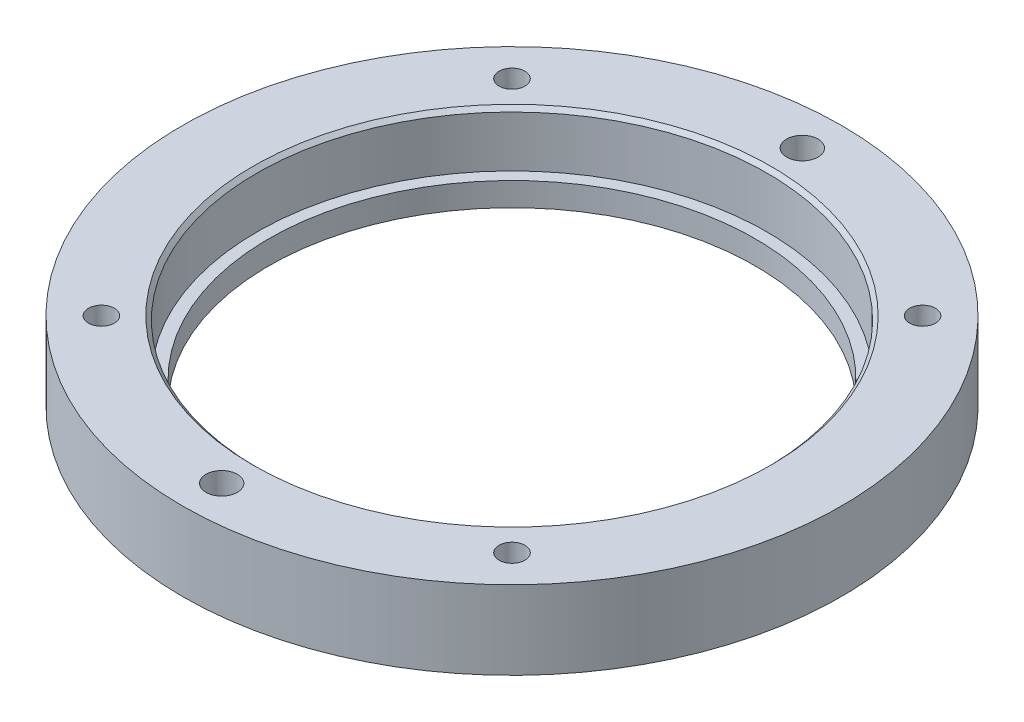
ISO-10303-21;
HEADER;
FILE_DESCRIPTION(('STEP AP214'),'2;1');
FILE_NAME('part.step','',(''),(''),'','','');
FILE_SCHEMA(('AUTOMOTIVE_DESIGN { 1 0 10303 214 1 1 1 1 }'));
ENDSEC;
DATA;
#1=APPLICATION_CONTEXT('core data for automotive mechanical design processes');
#2=APPLICATION_PROTOCOL_DEFINITION('international standard','automotive_design',2000,#1);
#3=PRODUCT_CONTEXT('',#1,'mechanical');
#4=PRODUCT('Part','Part','',(#3));
#5=PRODUCT_RELATED_PRODUCT_CATEGORY('part','',(#4));
#6=PRODUCT_DEFINITION_FORMATION('','',#4);
#7=PRODUCT_DEFINITION_CONTEXT('part definition',#1,'design');
#8=PRODUCT_DEFINITION('design','',#6,#7);
#9=PRODUCT_DEFINITION_SHAPE('','',#8);
#10=(LENGTH_UNIT() NAMED_UNIT(*) SI_UNIT(.MILLI.,.METRE.));
#11=(NAMED_UNIT(*) PLANE_ANGLE_UNIT() SI_UNIT($,.RADIAN.));
#12=(NAMED_UNIT(*) SI_UNIT($,.STERADIAN.) SOLID_ANGLE_UNIT());
#13=UNCERTAINTY_MEASURE_WITH_UNIT(LENGTH_MEASURE(1.E-05),#10,'distance_accuracy_value','');
#14=(GEOMETRIC_REPRESENTATION_CONTEXT(3) GLOBAL_UNCERTAINTY_ASSIGNED_CONTEXT((#13)) GLOBAL_UNIT_ASSIGNED_CONTEXT((#10,
#11,#12)) REPRESENTATION_CONTEXT('',''));
#15=CARTESIAN_POINT('',(0.,0.,0.));
#16=DIRECTION('',(0.,0.,1.));
#17=DIRECTION('',(1.,0.,0.));
#18=AXIS2_PLACEMENT_3D('',#15,#16,#17);
#19=CARTESIAN_POINT('',(0.,-3.,42.));
#20=DIRECTION('',(0.,-1.,0.));
#21=DIRECTION('',(0.,0.,-1.));
#22=AXIS2_PLACEMENT_3D('',#19,#20,#21);
#23=PLANE('',#22);
#24=CARTESIAN_POINT('',(-26.1629509039025,-3.,26.162950903902));
#25=DIRECTION('',(0.,-1.,0.));
#26=DIRECTION('',(0.,0.,-1.));
#27=AXIS2_PLACEMENT_3D('',#24,#25,#26);
#28=CIRCLE('',#27,1.64999999999999);
#29=CARTESIAN_POINT('',(-26.1629509039025,-3.,24.512950903902));
#30=VERTEX_POINT('',#29);
#31=EDGE_CURVE('E159',#30,#30,#28,.T.);
#32=ORIENTED_EDGE('',*,*,#31,.F.);
#33=EDGE_LOOP('',(#32));
#34=FACE_BOUND('',#33,.T.);
#35=CARTESIAN_POINT('',(26.1629509039023,-3.,26.1629509039022));
#36=DIRECTION('',(0.,-1.,0.));
#37=DIRECTION('',(0.,0.,-1.));
#38=AXIS2_PLACEMENT_3D('',#35,#36,#37);
#39=CIRCLE('',#38,1.64999999999999);
#40=CARTESIAN_POINT('',(26.1629509039023,-3.,24.5129509039022));
#41=VERTEX_POINT('',#40);
#42=EDGE_CURVE('E153',#41,#41,#39,.T.);
#43=ORIENTED_EDGE('',*,*,#42,.F.);
#44=EDGE_LOOP('',(#43));
#45=FACE_BOUND('',#44,.T.);
#46=CARTESIAN_POINT('',(26.1629509039023,-2.99999999999999,-26.1629509039022));
#47=DIRECTION('',(0.,-1.,0.));
#48=DIRECTION('',(0.,0.,-1.));
#49=AXIS2_PLACEMENT_3D('',#46,#47,#48);
#50=CIRCLE('',#49,1.64999999999999);
#51=CARTESIAN_POINT('',(26.1629509039023,-2.99999999999999,-27.8129509039022));
#52=VERTEX_POINT('',#51);
#53=EDGE_CURVE('E157',#52,#52,#50,.T.);
#54=ORIENTED_EDGE('',*,*,#53,.F.);
#55=EDGE_LOOP('',(#54));
#56=FACE_BOUND('',#55,.T.);
#57=CARTESIAN_POINT('',(-26.1629509039023,-2.99999999999999,-26.1629509039022));
#58=DIRECTION('',(0.,-1.,0.));
#59=DIRECTION('',(0.,0.,-1.));
#60=AXIS2_PLACEMENT_3D('',#57,#58,#59);
#61=CIRCLE('',#60,1.64999999999999);
#62=CARTESIAN_POINT('',(-26.1629509039023,-2.99999999999999,-27.8129509039022));
#63=VERTEX_POINT('',#62);
#64=EDGE_CURVE('E66',#63,#63,#61,.T.);
#65=ORIENTED_EDGE('',*,*,#64,.F.);
#66=EDGE_LOOP('',(#65));
#67=FACE_BOUND('',#66,.T.);
#68=CARTESIAN_POINT('',(0.,-3.,0.));
#69=DIRECTION('',(0.,1.,0.));
#70=DIRECTION('',(0.,0.,1.));
#71=AXIS2_PLACEMENT_3D('',#68,#69,#70);
#72=CIRCLE('',#71,31.);
#73=CARTESIAN_POINT('',(0.,-3.,31.));
#74=VERTEX_POINT('',#73);
#75=EDGE_CURVE('E84',#74,#74,#72,.T.);
#76=ORIENTED_EDGE('',*,*,#75,.T.);
#77=EDGE_LOOP('',(#76));
#78=FACE_BOUND('',#77,.T.);
#79=CARTESIAN_POINT('',(0.,-3.,0.));
#80=DIRECTION('',(0.,1.,0.));
#81=DIRECTION('',(0.,0.,1.));
#82=AXIS2_PLACEMENT_3D('',#79,#80,#81);
#83=CIRCLE('',#82,42.);
#84=CARTESIAN_POINT('',(0.,-3.,42.));
#85=VERTEX_POINT('',#84);
#86=EDGE_CURVE('E72',#85,#85,#83,.T.);
#87=ORIENTED_EDGE('',*,*,#86,.F.);
#88=EDGE_LOOP('',(#87));
#89=FACE_BOUND('',#88,.T.);
#90=ADVANCED_FACE('F35',(#34,#45,#56,#67,#78,#89),#23,.T.);
#91=CARTESIAN_POINT('',(0.,0.,0.));
#92=DIRECTION('',(0.,1.,0.));
#93=DIRECTION('',(0.,0.,1.));
#94=AXIS2_PLACEMENT_3D('',#91,#92,#93);
#95=CYLINDRICAL_SURFACE('',#94,31.);
#96=CARTESIAN_POINT('',(0.,0.,0.));
#97=DIRECTION('',(0.,1.,0.));
#98=DIRECTION('',(0.,0.,1.));
#99=AXIS2_PLACEMENT_3D('',#96,#97,#98);
#100=CIRCLE('',#99,31.);
#101=CARTESIAN_POINT('',(0.,0.,31.));
#102=VERTEX_POINT('',#101);
#103=EDGE_CURVE('E81',#102,#102,#100,.T.);
#104=ORIENTED_EDGE('',*,*,#103,.T.);
#105=EDGE_LOOP('',(#104));
#106=FACE_BOUND('',#105,.T.);
#107=ORIENTED_EDGE('',*,*,#75,.F.);
#108=EDGE_LOOP('',(#107));
#109=FACE_BOUND('',#108,.T.);
#110=ADVANCED_FACE('F103',(#106,#109),#95,.F.);
#111=CARTESIAN_POINT('',(0.,0.,31.));
#112=DIRECTION('',(0.,1.,0.));
#113=DIRECTION('',(0.,0.,1.));
#114=AXIS2_PLACEMENT_3D('',#111,#112,#113);
#115=PLANE('',#114);
#116=CARTESIAN_POINT('',(0.,0.,0.));
#117=DIRECTION('',(0.,1.,0.));
#118=DIRECTION('',(0.,0.,1.));
#119=AXIS2_PLACEMENT_3D('',#116,#117,#118);
#120=CIRCLE('',#119,32.5);
#121=CARTESIAN_POINT('',(0.,0.,32.5));
#122=VERTEX_POINT('',#121);
#123=EDGE_CURVE('E78',#122,#122,#120,.T.);
#124=ORIENTED_EDGE('',*,*,#123,.T.);
#125=EDGE_LOOP('',(#124));
#126=FACE_BOUND('',#125,.T.);
#127=ORIENTED_EDGE('',*,*,#103,.F.);
#128=EDGE_LOOP('',(#127));
#129=FACE_BOUND('',#128,.T.);
#130=ADVANCED_FACE('F108',(#126,#129),#115,.T.);
#131=CARTESIAN_POINT('',(0.,0.,0.));
#132=DIRECTION('',(0.,1.,0.));
#133=DIRECTION('',(0.,0.,1.));
#134=AXIS2_PLACEMENT_3D('',#131,#132,#133);
#135=CYLINDRICAL_SURFACE('',#134,32.5);
#136=CARTESIAN_POINT('',(0.,6.50000000000002,0.));
#137=DIRECTION('',(0.,1.,0.));
#138=DIRECTION('',(0.,0.,1.));
#139=AXIS2_PLACEMENT_3D('',#136,#137,#138);
#140=CIRCLE('',#139,32.5);
#141=CARTESIAN_POINT('',(0.,6.50000000000001,32.5));
#142=VERTEX_POINT('',#141);
#143=EDGE_CURVE('E43',#142,#142,#140,.T.);
#144=ORIENTED_EDGE('',*,*,#143,.T.);
#145=EDGE_LOOP('',(#144));
#146=FACE_BOUND('',#145,.T.);
#147=ORIENTED_EDGE('',*,*,#123,.F.);
#148=EDGE_LOOP('',(#147));
#149=FACE_BOUND('',#148,.T.);
#150=ADVANCED_FACE('F89',(#146,#149),#135,.F.);
#151=CARTESIAN_POINT('',(0.,7.,32.5));
#152=DIRECTION('',(0.,1.,0.));
#153=DIRECTION('',(0.,0.,1.));
#154=AXIS2_PLACEMENT_3D('',#151,#152,#153);
#155=PLANE('',#154);
#156=CARTESIAN_POINT('',(0.,7.,0.));
#157=DIRECTION('',(0.,1.,0.));
#158=DIRECTION('',(0.,0.,1.));
#159=AXIS2_PLACEMENT_3D('',#156,#157,#158);
#160=CIRCLE('',#159,33.);
#161=CARTESIAN_POINT('',(0.,7.,33.));
#162=VERTEX_POINT('',#161);
#163=EDGE_CURVE('E11',#162,#162,#160,.F.);
#164=ORIENTED_EDGE('',*,*,#163,.T.);
#165=EDGE_LOOP('',(#164));
#166=FACE_BOUND('',#165,.T.);
#167=CARTESIAN_POINT('',(-26.1629509039025,7.00000000000001,26.162950903902));
#168=DIRECTION('',(0.,1.,0.));
#169=DIRECTION('',(0.,0.,1.));
#170=AXIS2_PLACEMENT_3D('',#167,#168,#169);
#171=CIRCLE('',#170,1.64999999999999);
#172=CARTESIAN_POINT('',(-26.1629509039025,7.00000000000001,27.812950903902));
#173=VERTEX_POINT('',#172);
#174=EDGE_CURVE('E192',#173,#173,#171,.T.);
#175=ORIENTED_EDGE('',*,*,#174,.F.);
#176=EDGE_LOOP('',(#175));
#177=FACE_BOUND('',#176,.T.);
#178=CARTESIAN_POINT('',(26.1629509039023,7.00000000000001,26.1629509039022));
#179=DIRECTION('',(0.,1.,0.));
#180=DIRECTION('',(0.,0.,1.));
#181=AXIS2_PLACEMENT_3D('',#178,#179,#180);
#182=CIRCLE('',#181,1.64999999999999);
#183=CARTESIAN_POINT('',(26.1629509039023,7.00000000000001,27.8129509039022));
#184=VERTEX_POINT('',#183);
#185=EDGE_CURVE('E150',#184,#184,#182,.T.);
#186=ORIENTED_EDGE('',*,*,#185,.F.);
#187=EDGE_LOOP('',(#186));
#188=FACE_BOUND('',#187,.T.);
#189=CARTESIAN_POINT('',(26.1629509039023,7.00000000000001,-26.1629509039022));
#190=DIRECTION('',(0.,1.,0.));
#191=DIRECTION('',(0.,0.,1.));
#192=AXIS2_PLACEMENT_3D('',#189,#190,#191);
#193=CIRCLE('',#192,1.64999999999999);
#194=CARTESIAN_POINT('',(26.1629509039023,7.00000000000001,-24.5129509039022));
#195=VERTEX_POINT('',#194);
#196=EDGE_CURVE('E154',#195,#195,#193,.T.);
#197=ORIENTED_EDGE('',*,*,#196,.F.);
#198=EDGE_LOOP('',(#197));
#199=FACE_BOUND('',#198,.T.);
#200=CARTESIAN_POINT('',(-26.1629509039023,7.00000000000001,-26.1629509039022));
#201=DIRECTION('',(0.,1.,0.));
#202=DIRECTION('',(0.,0.,1.));
#203=AXIS2_PLACEMENT_3D('',#200,#201,#202);
#204=CIRCLE('',#203,1.64999999999999);
#205=CARTESIAN_POINT('',(-26.1629509039023,7.00000000000001,-24.5129509039022));
#206=VERTEX_POINT('',#205);
#207=EDGE_CURVE('E165',#206,#206,#204,.T.);
#208=ORIENTED_EDGE('',*,*,#207,.F.);
#209=EDGE_LOOP('',(#208));
#210=FACE_BOUND('',#209,.T.);
#211=CARTESIAN_POINT('',(0.,7.00000000000001,-37.));
#212=DIRECTION('',(0.,1.,0.));
#213=DIRECTION('',(0.,0.,1.));
#214=AXIS2_PLACEMENT_3D('',#211,#212,#213);
#215=CIRCLE('',#214,2.);
#216=CARTESIAN_POINT('',(0.,7.00000000000001,-35.));
#217=VERTEX_POINT('',#216);
#218=EDGE_CURVE('E60',#217,#217,#215,.T.);
#219=ORIENTED_EDGE('',*,*,#218,.F.);
#220=EDGE_LOOP('',(#219));
#221=FACE_BOUND('',#220,.T.);
#222=CARTESIAN_POINT('',(0.,7.,37.));
#223=DIRECTION('',(0.,1.,0.));
#224=DIRECTION('',(0.,0.,1.));
#225=AXIS2_PLACEMENT_3D('',#222,#223,#224);
#226=CIRCLE('',#225,2.);
#227=CARTESIAN_POINT('',(0.,7.,39.));
#228=VERTEX_POINT('',#227);
#229=EDGE_CURVE('E59',#228,#228,#226,.T.);
#230=ORIENTED_EDGE('',*,*,#229,.F.);
#231=EDGE_LOOP('',(#230));
#232=FACE_BOUND('',#231,.T.);
#233=CARTESIAN_POINT('',(0.,7.,0.));
#234=DIRECTION('',(0.,1.,0.));
#235=DIRECTION('',(0.,0.,1.));
#236=AXIS2_PLACEMENT_3D('',#233,#234,#235);
#237=CIRCLE('',#236,42.);
#238=CARTESIAN_POINT('',(0.,7.,42.));
#239=VERTEX_POINT('',#238);
#240=EDGE_CURVE('E75',#239,#239,#237,.T.);
#241=ORIENTED_EDGE('',*,*,#240,.T.);
#242=EDGE_LOOP('',(#241));
#243=FACE_BOUND('',#242,.T.);
#244=ADVANCED_FACE('F119',(#166,#177,#188,#199,#210,#221,#232,#243),#155,.T.);
#245=CARTESIAN_POINT('',(0.,0.,0.));
#246=DIRECTION('',(0.,1.,0.));
#247=DIRECTION('',(0.,0.,1.));
#248=AXIS2_PLACEMENT_3D('',#245,#246,#247);
#249=CYLINDRICAL_SURFACE('',#248,42.);
#250=ORIENTED_EDGE('',*,*,#86,.T.);
#251=EDGE_LOOP('',(#250));
#252=FACE_BOUND('',#251,.T.);
#253=ORIENTED_EDGE('',*,*,#240,.F.);
#254=EDGE_LOOP('',(#253));
#255=FACE_BOUND('',#254,.T.);
#256=ADVANCED_FACE('F122',(#252,#255),#249,.T.);
#257=CARTESIAN_POINT('',(0.,2.,37.));
#258=DIRECTION('',(0.,1.,0.));
#259=DIRECTION('',(0.,0.,1.));
#260=AXIS2_PLACEMENT_3D('',#257,#258,#259);
#261=CONICAL_SURFACE('',#260,2.,1.02974425867665);
#262=CARTESIAN_POINT('',(0.,0.798278761944879,37.));
#263=VERTEX_POINT('',#262);
#264=VERTEX_LOOP('',#263);
#265=FACE_BOUND('',#264,.T.);
#266=CARTESIAN_POINT('',(0.,2.,37.));
#267=DIRECTION('',(0.,1.,0.));
#268=DIRECTION('',(0.,0.,1.));
#269=AXIS2_PLACEMENT_3D('',#266,#267,#268);
#270=CIRCLE('',#269,2.);
#271=CARTESIAN_POINT('',(0.,2.,39.));
#272=VERTEX_POINT('',#271);
#273=EDGE_CURVE('E63',#272,#272,#270,.T.);
#274=ORIENTED_EDGE('',*,*,#273,.T.);
#275=EDGE_LOOP('',(#274));
#276=FACE_BOUND('',#275,.T.);
#277=ADVANCED_FACE('F126',(#265,#276),#261,.F.);
#278=CARTESIAN_POINT('',(0.,7.,37.));
#279=DIRECTION('',(0.,1.,0.));
#280=DIRECTION('',(0.,0.,1.));
#281=AXIS2_PLACEMENT_3D('',#278,#279,#280);
#282=CYLINDRICAL_SURFACE('',#281,2.);
#283=ORIENTED_EDGE('',*,*,#273,.F.);
#284=EDGE_LOOP('',(#283));
#285=FACE_BOUND('',#284,.T.);
#286=ORIENTED_EDGE('',*,*,#229,.T.);
#287=EDGE_LOOP('',(#286));
#288=FACE_BOUND('',#287,.T.);
#289=ADVANCED_FACE('F53',(#285,#288),#282,.F.);
#290=CARTESIAN_POINT('',(0.,2.00000000000001,-37.));
#291=DIRECTION('',(0.,1.,0.));
#292=DIRECTION('',(0.,0.,1.));
#293=AXIS2_PLACEMENT_3D('',#290,#291,#292);
#294=CONICAL_SURFACE('',#293,2.,1.02974425867665);
#295=CARTESIAN_POINT('',(0.,0.798278761944888,-37.));
#296=VERTEX_POINT('',#295);
#297=VERTEX_LOOP('',#296);
#298=FACE_BOUND('',#297,.T.);
#299=CARTESIAN_POINT('',(0.,2.00000000000001,-37.));
#300=DIRECTION('',(0.,1.,0.));
#301=DIRECTION('',(0.,0.,1.));
#302=AXIS2_PLACEMENT_3D('',#299,#300,#301);
#303=CIRCLE('',#302,2.);
#304=CARTESIAN_POINT('',(0.,2.00000000000001,-35.));
#305=VERTEX_POINT('',#304);
#306=EDGE_CURVE('E57',#305,#305,#303,.T.);
#307=ORIENTED_EDGE('',*,*,#306,.T.);
#308=EDGE_LOOP('',(#307));
#309=FACE_BOUND('',#308,.T.);
#310=ADVANCED_FACE('F49',(#298,#309),#294,.F.);
#311=CARTESIAN_POINT('',(0.,7.00000000000001,-37.));
#312=DIRECTION('',(0.,1.,0.));
#313=DIRECTION('',(0.,0.,1.));
#314=AXIS2_PLACEMENT_3D('',#311,#312,#313);
#315=CYLINDRICAL_SURFACE('',#314,2.);
#316=ORIENTED_EDGE('',*,*,#306,.F.);
#317=EDGE_LOOP('',(#316));
#318=FACE_BOUND('',#317,.T.);
#319=ORIENTED_EDGE('',*,*,#218,.T.);
#320=EDGE_LOOP('',(#319));
#321=FACE_BOUND('',#320,.T.);
#322=ADVANCED_FACE('F52',(#318,#321),#315,.F.);
#323=CARTESIAN_POINT('',(-26.1629509039023,7.00000000000001,-26.1629509039022));
#324=DIRECTION('',(0.,1.,0.));
#325=DIRECTION('',(0.,0.,1.));
#326=AXIS2_PLACEMENT_3D('',#323,#324,#325);
#327=CYLINDRICAL_SURFACE('',#326,1.64999999999999);
#328=ORIENTED_EDGE('',*,*,#207,.T.);
#329=EDGE_LOOP('',(#328));
#330=FACE_BOUND('',#329,.T.);
#331=ORIENTED_EDGE('',*,*,#64,.T.);
#332=EDGE_LOOP('',(#331));
#333=FACE_BOUND('',#332,.T.);
#334=ADVANCED_FACE('F135',(#330,#333),#327,.F.);
#335=CARTESIAN_POINT('',(26.1629509039023,7.00000000000001,-26.1629509039022));
#336=DIRECTION('',(0.,1.,0.));
#337=DIRECTION('',(0.,0.,1.));
#338=AXIS2_PLACEMENT_3D('',#335,#336,#337);
#339=CYLINDRICAL_SURFACE('',#338,1.64999999999999);
#340=ORIENTED_EDGE('',*,*,#196,.T.);
#341=EDGE_LOOP('',(#340));
#342=FACE_BOUND('',#341,.T.);
#343=ORIENTED_EDGE('',*,*,#53,.T.);
#344=EDGE_LOOP('',(#343));
#345=FACE_BOUND('',#344,.T.);
#346=ADVANCED_FACE('F138',(#342,#345),#339,.F.);
#347=CARTESIAN_POINT('',(26.1629509039023,7.00000000000001,26.1629509039022));
#348=DIRECTION('',(0.,1.,0.));
#349=DIRECTION('',(0.,0.,1.));
#350=AXIS2_PLACEMENT_3D('',#347,#348,#349);
#351=CYLINDRICAL_SURFACE('',#350,1.64999999999999);
#352=ORIENTED_EDGE('',*,*,#185,.T.);
#353=EDGE_LOOP('',(#352));
#354=FACE_BOUND('',#353,.T.);
#355=ORIENTED_EDGE('',*,*,#42,.T.);
#356=EDGE_LOOP('',(#355));
#357=FACE_BOUND('',#356,.T.);
#358=ADVANCED_FACE('F98',(#354,#357),#351,.F.);
#359=CARTESIAN_POINT('',(-26.1629509039025,7.00000000000001,26.162950903902));
#360=DIRECTION('',(0.,1.,0.));
#361=DIRECTION('',(0.,0.,1.));
#362=AXIS2_PLACEMENT_3D('',#359,#360,#361);
#363=CYLINDRICAL_SURFACE('',#362,1.64999999999999);
#364=ORIENTED_EDGE('',*,*,#174,.T.);
#365=EDGE_LOOP('',(#364));
#366=FACE_BOUND('',#365,.T.);
#367=ORIENTED_EDGE('',*,*,#31,.T.);
#368=EDGE_LOOP('',(#367));
#369=FACE_BOUND('',#368,.T.);
#370=ADVANCED_FACE('F93',(#366,#369),#363,.F.);
#371=CARTESIAN_POINT('',(0.,6.50000000000002,0.));
#372=DIRECTION('',(0.,1.,0.));
#373=DIRECTION('',(0.,0.,1.));
#374=AXIS2_PLACEMENT_3D('',#371,#372,#373);
#375=CONICAL_SURFACE('',#374,32.5,0.785398163397455);
#376=ORIENTED_EDGE('',*,*,#163,.F.);
#377=EDGE_LOOP('',(#376));
#378=FACE_BOUND('',#377,.T.);
#379=ORIENTED_EDGE('',*,*,#143,.F.);
#380=EDGE_LOOP('',(#379));
#381=FACE_BOUND('',#380,.T.);
#382=ADVANCED_FACE('F37',(#378,#381),#375,.F.);
#383=CLOSED_SHELL('',(#90,#110,#130,#150,#244,#256,#277,#289,#310,#322,#334,#346,#358,#370,#382));
#384=MANIFOLD_SOLID_BREP('B2',#383);
#385=ADVANCED_BREP_SHAPE_REPRESENTATION('',(#18,#384),#14);
#386=SHAPE_DEFINITION_REPRESENTATION(#9,#385);
ENDSEC;
END-ISO-10303-21;
